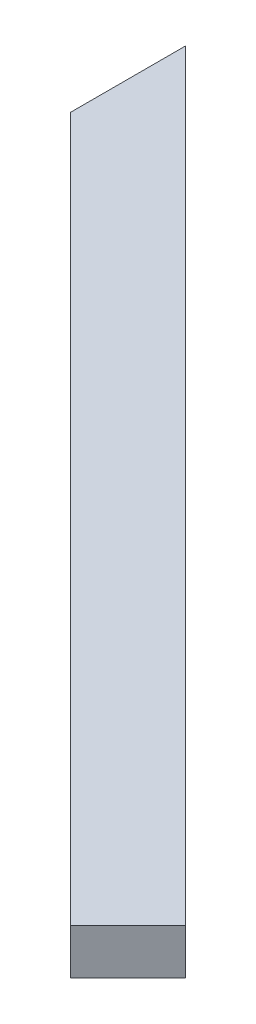
ISO-10303-21;
HEADER;
FILE_DESCRIPTION(('STEP AP214'),'2;1');
FILE_NAME('part.step','',(''),(''),'','','');
FILE_SCHEMA(('AUTOMOTIVE_DESIGN { 1 0 10303 214 1 1 1 1 }'));
ENDSEC;
DATA;
#1=APPLICATION_CONTEXT('core data for automotive mechanical design processes');
#2=APPLICATION_PROTOCOL_DEFINITION('international standard','automotive_design',2000,#1);
#3=PRODUCT_CONTEXT('',#1,'mechanical');
#4=PRODUCT('Part','Part','',(#3));
#5=PRODUCT_RELATED_PRODUCT_CATEGORY('part','',(#4));
#6=PRODUCT_DEFINITION_FORMATION('','',#4);
#7=PRODUCT_DEFINITION_CONTEXT('part definition',#1,'design');
#8=PRODUCT_DEFINITION('design','',#6,#7);
#9=PRODUCT_DEFINITION_SHAPE('','',#8);
#10=(LENGTH_UNIT() NAMED_UNIT(*) SI_UNIT(.MILLI.,.METRE.));
#11=(NAMED_UNIT(*) PLANE_ANGLE_UNIT() SI_UNIT($,.RADIAN.));
#12=(NAMED_UNIT(*) SI_UNIT($,.STERADIAN.) SOLID_ANGLE_UNIT());
#13=UNCERTAINTY_MEASURE_WITH_UNIT(LENGTH_MEASURE(1.E-05),#10,'distance_accuracy_value','');
#14=(GEOMETRIC_REPRESENTATION_CONTEXT(3) GLOBAL_UNCERTAINTY_ASSIGNED_CONTEXT((#13)) GLOBAL_UNIT_ASSIGNED_CONTEXT((#10,
#11,#12)) REPRESENTATION_CONTEXT('',''));
#15=CARTESIAN_POINT('',(0.,0.,0.));
#16=DIRECTION('',(0.,0.,1.));
#17=DIRECTION('',(1.,0.,0.));
#18=AXIS2_PLACEMENT_3D('',#15,#16,#17);
#19=CARTESIAN_POINT('',(35.1155,0.,-14.1463446288162));
#20=DIRECTION('',(1.,0.,0.));
#21=DIRECTION('',(0.,0.,-1.));
#22=AXIS2_PLACEMENT_3D('',#19,#20,#21);
#23=PLANE('',#22);
#24=DIRECTION('',(0.,0.,1.));
#25=VECTOR('',#24,1.);
#26=CARTESIAN_POINT('',(35.1155,0.,-136.622759184095));
#27=LINE('',#26,#25);
#28=CARTESIAN_POINT('',(35.1155,0.,44.5540065117316));
#29=VERTEX_POINT('',#28);
#30=CARTESIAN_POINT('',(35.1155,0.,56.0846553711845));
#31=VERTEX_POINT('',#30);
#32=EDGE_CURVE('E40',#29,#31,#27,.T.);
#33=ORIENTED_EDGE('',*,*,#32,.T.);
#34=DIRECTION('',(0.,1.,0.));
#35=VECTOR('',#34,1.);
#36=CARTESIAN_POINT('',(35.1155,29.2100000000003,56.0846553711845));
#37=LINE('',#36,#35);
#38=CARTESIAN_POINT('',(35.1155,4.572,56.0846553711844));
#39=VERTEX_POINT('',#38);
#40=EDGE_CURVE('E45',#31,#39,#37,.T.);
#41=ORIENTED_EDGE('',*,*,#40,.T.);
#42=DIRECTION('',(0.,0.,-1.));
#43=VECTOR('',#42,1.);
#44=CARTESIAN_POINT('',(35.1155,4.572,149.86));
#45=LINE('',#44,#43);
#46=CARTESIAN_POINT('',(35.1155,4.572,44.5540065117316));
#47=VERTEX_POINT('',#46);
#48=EDGE_CURVE('E106',#39,#47,#45,.T.);
#49=ORIENTED_EDGE('',*,*,#48,.T.);
#50=DIRECTION('',(0.,-1.,0.));
#51=VECTOR('',#50,1.);
#52=CARTESIAN_POINT('',(35.1155,29.2099999999998,44.5540065117316));
#53=LINE('',#52,#51);
#54=EDGE_CURVE('E11',#47,#29,#53,.T.);
#55=ORIENTED_EDGE('',*,*,#54,.T.);
#56=EDGE_LOOP('',(#33,#41,#49,#55));
#57=FACE_BOUND('',#56,.T.);
#58=ADVANCED_FACE('F37',(#57),#23,.F.);
#59=CARTESIAN_POINT('',(-60.3181446143553,0.,-136.622759184095));
#60=DIRECTION('',(0.,-1.,0.));
#61=DIRECTION('',(0.,0.,-1.));
#62=AXIS2_PLACEMENT_3D('',#59,#60,#61);
#63=PLANE('',#62);
#64=ORIENTED_EDGE('',*,*,#32,.F.);
#65=DIRECTION('',(0.707106781186546,0.,0.707106781186549));
#66=VECTOR('',#65,1.);
#67=CARTESIAN_POINT('',(17.9396355106206,0.,27.3781420223522));
#68=LINE('',#67,#66);
#69=CARTESIAN_POINT('',(111.603706853372,0.,121.042213365104));
#70=VERTEX_POINT('',#69);
#71=EDGE_CURVE('E82',#29,#70,#68,.T.);
#72=ORIENTED_EDGE('',*,*,#71,.T.);
#73=DIRECTION('',(0.707106781186548,0.,-0.707106781186547));
#74=VECTOR('',#73,1.);
#75=CARTESIAN_POINT('',(105.838382423645,0.,126.80753779483));
#76=LINE('',#75,#74);
#77=CARTESIAN_POINT('',(105.838382423645,0.,126.80753779483));
#78=VERTEX_POINT('',#77);
#79=EDGE_CURVE('E86',#78,#70,#76,.T.);
#80=ORIENTED_EDGE('',*,*,#79,.F.);
#81=DIRECTION('',(0.707106781186546,0.,0.707106781186549));
#82=VECTOR('',#81,1.);
#83=CARTESIAN_POINT('',(12.1743110808942,0.,33.1434664520786));
#84=LINE('',#83,#82);
#85=EDGE_CURVE('E76',#31,#78,#84,.T.);
#86=ORIENTED_EDGE('',*,*,#85,.F.);
#87=EDGE_LOOP('',(#64,#72,#80,#86));
#88=FACE_BOUND('',#87,.T.);
#89=ADVANCED_FACE('F87',(#88),#63,.T.);
#90=CARTESIAN_POINT('',(105.838382423645,0.,126.80753779483));
#91=DIRECTION('',(-0.707106781186546,0.,-0.707106781186549));
#92=DIRECTION('',(-0.707106781186549,0.,0.707106781186546));
#93=AXIS2_PLACEMENT_3D('',#90,#91,#92);
#94=PLANE('',#93);
#95=DIRECTION('',(0.,-1.,0.));
#96=VECTOR('',#95,1.);
#97=CARTESIAN_POINT('',(105.838382423645,0.,126.80753779483));
#98=LINE('',#97,#96);
#99=CARTESIAN_POINT('',(105.838382423645,4.572,126.80753779483));
#100=VERTEX_POINT('',#99);
#101=EDGE_CURVE('E80',#100,#78,#98,.T.);
#102=ORIENTED_EDGE('',*,*,#101,.T.);
#103=ORIENTED_EDGE('',*,*,#79,.T.);
#104=DIRECTION('',(0.,1.,0.));
#105=VECTOR('',#104,1.);
#106=CARTESIAN_POINT('',(111.603706853372,0.,121.042213365104));
#107=LINE('',#106,#105);
#108=CARTESIAN_POINT('',(111.603706853372,4.572,121.042213365104));
#109=VERTEX_POINT('',#108);
#110=EDGE_CURVE('E92',#70,#109,#107,.T.);
#111=ORIENTED_EDGE('',*,*,#110,.T.);
#112=DIRECTION('',(-0.707106781186549,0.,0.707106781186546));
#113=VECTOR('',#112,1.);
#114=CARTESIAN_POINT('',(105.838382423645,4.572,126.80753779483));
#115=LINE('',#114,#113);
#116=EDGE_CURVE('E83',#109,#100,#115,.T.);
#117=ORIENTED_EDGE('',*,*,#116,.T.);
#118=EDGE_LOOP('',(#102,#103,#111,#117));
#119=FACE_BOUND('',#118,.T.);
#120=ADVANCED_FACE('F95',(#119),#94,.F.);
#121=CARTESIAN_POINT('',(12.1743110808942,4.572,33.1434664520786));
#122=DIRECTION('',(0.,1.,0.));
#123=DIRECTION('',(0.,0.,1.));
#124=AXIS2_PLACEMENT_3D('',#121,#122,#123);
#125=PLANE('',#124);
#126=ORIENTED_EDGE('',*,*,#48,.F.);
#127=DIRECTION('',(0.707106781186546,0.,0.707106781186549));
#128=VECTOR('',#127,1.);
#129=CARTESIAN_POINT('',(12.1743110808942,4.572,33.1434664520786));
#130=LINE('',#129,#128);
#131=EDGE_CURVE('E101',#39,#100,#130,.T.);
#132=ORIENTED_EDGE('',*,*,#131,.T.);
#133=ORIENTED_EDGE('',*,*,#116,.F.);
#134=DIRECTION('',(0.707106781186546,0.,0.707106781186549));
#135=VECTOR('',#134,1.);
#136=CARTESIAN_POINT('',(17.9396355106206,4.572,27.3781420223522));
#137=LINE('',#136,#135);
#138=EDGE_CURVE('E103',#47,#109,#137,.T.);
#139=ORIENTED_EDGE('',*,*,#138,.F.);
#140=EDGE_LOOP('',(#126,#132,#133,#139));
#141=FACE_BOUND('',#140,.T.);
#142=ADVANCED_FACE('F111',(#141),#125,.T.);
#143=CARTESIAN_POINT('',(17.9396355106206,0.,27.3781420223522));
#144=DIRECTION('',(0.707106781186549,0.,-0.707106781186546));
#145=DIRECTION('',(-0.707106781186546,0.,-0.707106781186549));
#146=AXIS2_PLACEMENT_3D('',#143,#144,#145);
#147=PLANE('',#146);
#148=ORIENTED_EDGE('',*,*,#54,.F.);
#149=ORIENTED_EDGE('',*,*,#138,.T.);
#150=ORIENTED_EDGE('',*,*,#110,.F.);
#151=ORIENTED_EDGE('',*,*,#71,.F.);
#152=EDGE_LOOP('',(#148,#149,#150,#151));
#153=FACE_BOUND('',#152,.T.);
#154=ADVANCED_FACE('F109',(#153),#147,.T.);
#155=CARTESIAN_POINT('',(12.1743110808942,0.,33.1434664520786));
#156=DIRECTION('',(-0.707106781186549,0.,0.707106781186546));
#157=DIRECTION('',(0.707106781186546,0.,0.707106781186549));
#158=AXIS2_PLACEMENT_3D('',#155,#156,#157);
#159=PLANE('',#158);
#160=ORIENTED_EDGE('',*,*,#40,.F.);
#161=ORIENTED_EDGE('',*,*,#85,.T.);
#162=ORIENTED_EDGE('',*,*,#101,.F.);
#163=ORIENTED_EDGE('',*,*,#131,.F.);
#164=EDGE_LOOP('',(#160,#161,#162,#163));
#165=FACE_BOUND('',#164,.T.);
#166=ADVANCED_FACE('F78',(#165),#159,.T.);
#167=CLOSED_SHELL('',(#58,#89,#120,#142,#154,#166));
#168=MANIFOLD_SOLID_BREP('B2',#167);
#169=ADVANCED_BREP_SHAPE_REPRESENTATION('',(#18,#168),#14);
#170=SHAPE_DEFINITION_REPRESENTATION(#9,#169);
ENDSEC;
END-ISO-10303-21;
